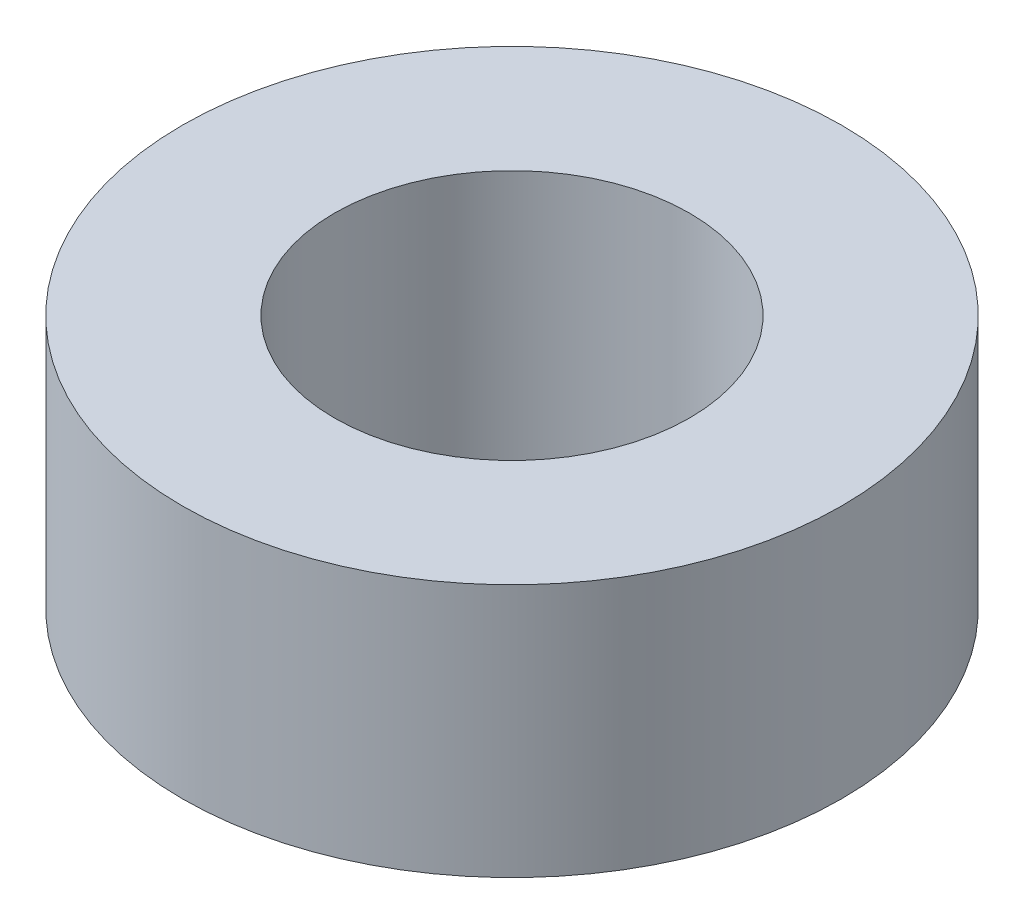
ISO-10303-21;
HEADER;
FILE_DESCRIPTION(('STEP AP214'),'2;1');
FILE_NAME('part.step','',(''),(''),'','','');
FILE_SCHEMA(('AUTOMOTIVE_DESIGN { 1 0 10303 214 1 1 1 1 }'));
ENDSEC;
DATA;
#1=APPLICATION_CONTEXT('core data for automotive mechanical design processes');
#2=APPLICATION_PROTOCOL_DEFINITION('international standard','automotive_design',2000,#1);
#3=PRODUCT_CONTEXT('',#1,'mechanical');
#4=PRODUCT('Part','Part','',(#3));
#5=PRODUCT_RELATED_PRODUCT_CATEGORY('part','',(#4));
#6=PRODUCT_DEFINITION_FORMATION('','',#4);
#7=PRODUCT_DEFINITION_CONTEXT('part definition',#1,'design');
#8=PRODUCT_DEFINITION('design','',#6,#7);
#9=PRODUCT_DEFINITION_SHAPE('','',#8);
#10=(LENGTH_UNIT() NAMED_UNIT(*) SI_UNIT(.MILLI.,.METRE.));
#11=(NAMED_UNIT(*) PLANE_ANGLE_UNIT() SI_UNIT($,.RADIAN.));
#12=(NAMED_UNIT(*) SI_UNIT($,.STERADIAN.) SOLID_ANGLE_UNIT());
#13=UNCERTAINTY_MEASURE_WITH_UNIT(LENGTH_MEASURE(1.E-05),#10,'distance_accuracy_value','');
#14=(GEOMETRIC_REPRESENTATION_CONTEXT(3) GLOBAL_UNCERTAINTY_ASSIGNED_CONTEXT((#13)) GLOBAL_UNIT_ASSIGNED_CONTEXT((#10,
#11,#12)) REPRESENTATION_CONTEXT('',''));
#15=CARTESIAN_POINT('',(0.,0.,0.));
#16=DIRECTION('',(0.,0.,1.));
#17=DIRECTION('',(1.,0.,0.));
#18=AXIS2_PLACEMENT_3D('',#15,#16,#17);
#19=CARTESIAN_POINT('',(0.,5.,0.));
#20=DIRECTION('',(0.,1.,0.));
#21=DIRECTION('',(0.,0.,1.));
#22=AXIS2_PLACEMENT_3D('',#19,#20,#21);
#23=PLANE('',#22);
#24=CARTESIAN_POINT('',(0.,5.,0.));
#25=DIRECTION('',(0.,1.,0.));
#26=DIRECTION('',(0.,0.,1.));
#27=AXIS2_PLACEMENT_3D('',#24,#25,#26);
#28=CIRCLE('',#27,6.5);
#29=CARTESIAN_POINT('',(0.,5.,6.5));
#30=VERTEX_POINT('',#29);
#31=EDGE_CURVE('E10',#30,#30,#28,.T.);
#32=ORIENTED_EDGE('',*,*,#31,.T.);
#33=EDGE_LOOP('',(#32));
#34=FACE_BOUND('',#33,.T.);
#35=CARTESIAN_POINT('',(0.,5.,0.));
#36=DIRECTION('',(0.,1.,0.));
#37=DIRECTION('',(0.,0.,1.));
#38=AXIS2_PLACEMENT_3D('',#35,#36,#37);
#39=CIRCLE('',#38,3.5);
#40=CARTESIAN_POINT('',(0.,5.,3.5));
#41=VERTEX_POINT('',#40);
#42=EDGE_CURVE('E46',#41,#41,#39,.T.);
#43=ORIENTED_EDGE('',*,*,#42,.F.);
#44=EDGE_LOOP('',(#43));
#45=FACE_BOUND('',#44,.T.);
#46=ADVANCED_FACE('F35',(#34,#45),#23,.T.);
#47=CARTESIAN_POINT('',(0.,0.,0.));
#48=DIRECTION('',(0.,1.,0.));
#49=DIRECTION('',(0.,0.,1.));
#50=AXIS2_PLACEMENT_3D('',#47,#48,#49);
#51=PLANE('',#50);
#52=CARTESIAN_POINT('',(0.,0.,0.));
#53=DIRECTION('',(0.,1.,0.));
#54=DIRECTION('',(0.,0.,1.));
#55=AXIS2_PLACEMENT_3D('',#52,#53,#54);
#56=CIRCLE('',#55,6.5);
#57=CARTESIAN_POINT('',(0.,0.,6.5));
#58=VERTEX_POINT('',#57);
#59=EDGE_CURVE('E39',#58,#58,#56,.T.);
#60=ORIENTED_EDGE('',*,*,#59,.F.);
#61=EDGE_LOOP('',(#60));
#62=FACE_BOUND('',#61,.T.);
#63=CARTESIAN_POINT('',(0.,0.,0.));
#64=DIRECTION('',(0.,1.,0.));
#65=DIRECTION('',(0.,0.,1.));
#66=AXIS2_PLACEMENT_3D('',#63,#64,#65);
#67=CIRCLE('',#66,3.5);
#68=CARTESIAN_POINT('',(0.,0.,3.5));
#69=VERTEX_POINT('',#68);
#70=EDGE_CURVE('E48',#69,#69,#67,.T.);
#71=ORIENTED_EDGE('',*,*,#70,.T.);
#72=EDGE_LOOP('',(#71));
#73=FACE_BOUND('',#72,.T.);
#74=ADVANCED_FACE('F58',(#62,#73),#51,.F.);
#75=CARTESIAN_POINT('',(0.,5.,0.));
#76=DIRECTION('',(0.,-1.,0.));
#77=DIRECTION('',(0.,0.,-1.));
#78=AXIS2_PLACEMENT_3D('',#75,#76,#77);
#79=CYLINDRICAL_SURFACE('',#78,6.5);
#80=ORIENTED_EDGE('',*,*,#31,.F.);
#81=EDGE_LOOP('',(#80));
#82=FACE_BOUND('',#81,.T.);
#83=ORIENTED_EDGE('',*,*,#59,.T.);
#84=EDGE_LOOP('',(#83));
#85=FACE_BOUND('',#84,.T.);
#86=ADVANCED_FACE('F37',(#82,#85),#79,.T.);
#87=CARTESIAN_POINT('',(0.,5.,0.));
#88=DIRECTION('',(0.,-1.,0.));
#89=DIRECTION('',(0.,0.,-1.));
#90=AXIS2_PLACEMENT_3D('',#87,#88,#89);
#91=CYLINDRICAL_SURFACE('',#90,3.5);
#92=ORIENTED_EDGE('',*,*,#42,.T.);
#93=EDGE_LOOP('',(#92));
#94=FACE_BOUND('',#93,.T.);
#95=ORIENTED_EDGE('',*,*,#70,.F.);
#96=EDGE_LOOP('',(#95));
#97=FACE_BOUND('',#96,.T.);
#98=ADVANCED_FACE('F54',(#94,#97),#91,.F.);
#99=CLOSED_SHELL('',(#46,#74,#86,#98));
#100=CARTESIAN_POINT('',(0.,4.,0.));
#101=DIRECTION('',(0.,1.,0.));
#102=DIRECTION('',(0.,0.,1.));
#103=AXIS2_PLACEMENT_3D('',#100,#101,#102);
#104=TOROIDAL_SURFACE('',#103,5.,0.500000000000001);
#105=CARTESIAN_POINT('',(0.,4.,5.5));
#106=VERTEX_POINT('',#105);
#107=VERTEX_LOOP('',#106);
#108=FACE_BOUND('',#107,.T.);
#109=ADVANCED_FACE('F77',(#108),#104,.F.);
#110=CLOSED_SHELL('',(#109));
#111=CARTESIAN_POINT('',(0.,2.5,0.));
#112=DIRECTION('',(0.,1.,0.));
#113=DIRECTION('',(0.,0.,1.));
#114=AXIS2_PLACEMENT_3D('',#111,#112,#113);
#115=TOROIDAL_SURFACE('',#114,5.,0.500000000000001);
#116=CARTESIAN_POINT('',(0.,2.5,5.5));
#117=VERTEX_POINT('',#116);
#118=VERTEX_LOOP('',#117);
#119=FACE_BOUND('',#118,.T.);
#120=ADVANCED_FACE('F72',(#119),#115,.F.);
#121=CLOSED_SHELL('',(#120));
#122=CARTESIAN_POINT('',(0.,1.,0.));
#123=DIRECTION('',(0.,1.,0.));
#124=DIRECTION('',(0.,0.,1.));
#125=AXIS2_PLACEMENT_3D('',#122,#123,#124);
#126=TOROIDAL_SURFACE('',#125,5.,0.500000000000001);
#127=CARTESIAN_POINT('',(0.,1.,5.5));
#128=VERTEX_POINT('',#127);
#129=VERTEX_LOOP('',#128);
#130=FACE_BOUND('',#129,.T.);
#131=ADVANCED_FACE('F67',(#130),#126,.F.);
#132=CLOSED_SHELL('',(#131));
#133=ORIENTED_CLOSED_SHELL('',*,#110,.T.);
#134=ORIENTED_CLOSED_SHELL('',*,#121,.T.);
#135=ORIENTED_CLOSED_SHELL('',*,#132,.T.);
#136=BREP_WITH_VOIDS('B2',#99,(#133,#134,#135));
#137=ADVANCED_BREP_SHAPE_REPRESENTATION('',(#18,#136),#14);
#138=SHAPE_DEFINITION_REPRESENTATION(#9,#137);
ENDSEC;
END-ISO-10303-21;
